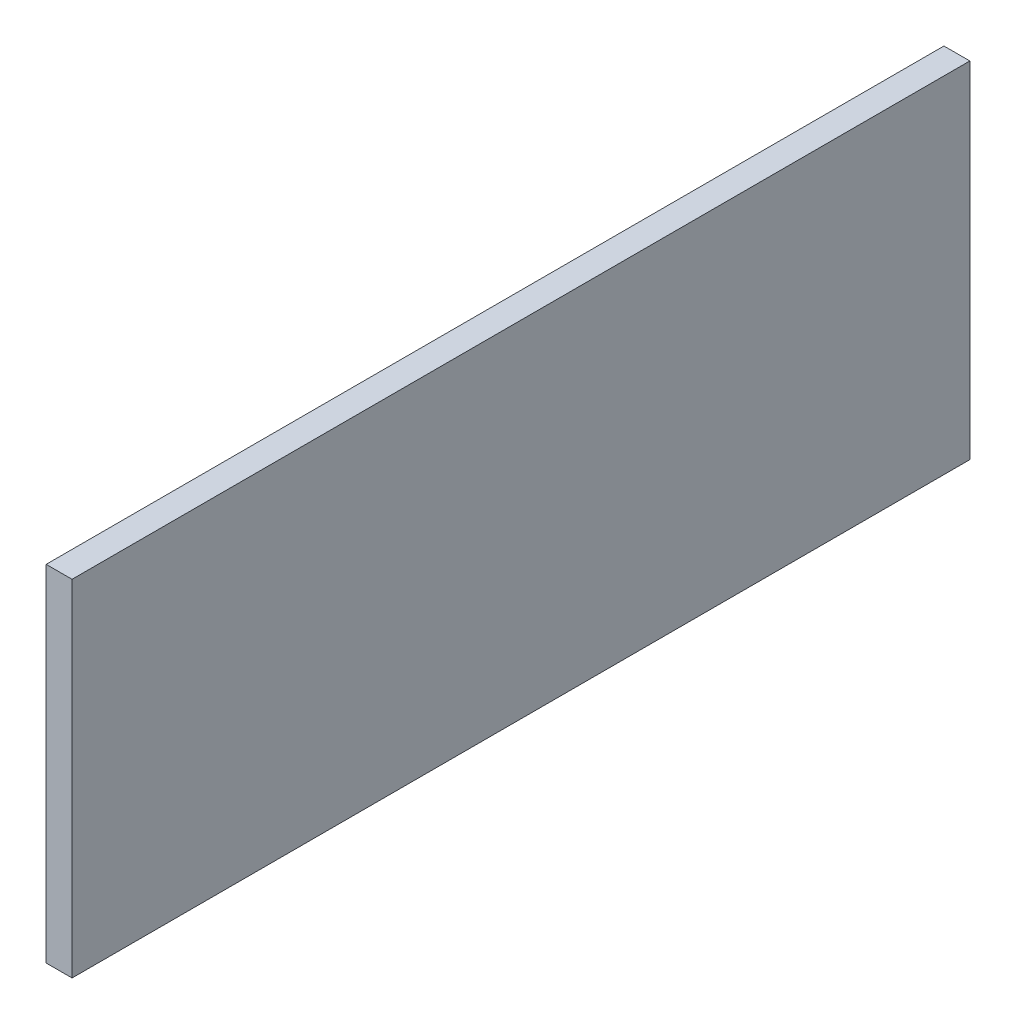
ISO-10303-21;
HEADER;
FILE_DESCRIPTION(('STEP AP214'),'2;1');
FILE_NAME('part.step','',(''),(''),'','','');
FILE_SCHEMA(('AUTOMOTIVE_DESIGN { 1 0 10303 214 1 1 1 1 }'));
ENDSEC;
DATA;
#1=APPLICATION_CONTEXT('core data for automotive mechanical design processes');
#2=APPLICATION_PROTOCOL_DEFINITION('international standard','automotive_design',2000,#1);
#3=PRODUCT_CONTEXT('',#1,'mechanical');
#4=PRODUCT('Part','Part','',(#3));
#5=PRODUCT_RELATED_PRODUCT_CATEGORY('part','',(#4));
#6=PRODUCT_DEFINITION_FORMATION('','',#4);
#7=PRODUCT_DEFINITION_CONTEXT('part definition',#1,'design');
#8=PRODUCT_DEFINITION('design','',#6,#7);
#9=PRODUCT_DEFINITION_SHAPE('','',#8);
#10=(LENGTH_UNIT() NAMED_UNIT(*) SI_UNIT(.MILLI.,.METRE.));
#11=(NAMED_UNIT(*) PLANE_ANGLE_UNIT() SI_UNIT($,.RADIAN.));
#12=(NAMED_UNIT(*) SI_UNIT($,.STERADIAN.) SOLID_ANGLE_UNIT());
#13=UNCERTAINTY_MEASURE_WITH_UNIT(LENGTH_MEASURE(1.E-05),#10,'distance_accuracy_value','');
#14=(GEOMETRIC_REPRESENTATION_CONTEXT(3) GLOBAL_UNCERTAINTY_ASSIGNED_CONTEXT((#13)) GLOBAL_UNIT_ASSIGNED_CONTEXT((#10,
#11,#12)) REPRESENTATION_CONTEXT('',''));
#15=CARTESIAN_POINT('',(0.,0.,0.));
#16=DIRECTION('',(0.,0.,1.));
#17=DIRECTION('',(1.,0.,0.));
#18=AXIS2_PLACEMENT_3D('',#15,#16,#17);
#19=CARTESIAN_POINT('',(15.,0.,260.));
#20=DIRECTION('',(0.,0.,-1.));
#21=DIRECTION('',(0.,1.,0.));
#22=AXIS2_PLACEMENT_3D('',#19,#20,#21);
#23=PLANE('',#22);
#24=DIRECTION('',(0.,-1.,0.));
#25=VECTOR('',#24,1.);
#26=CARTESIAN_POINT('',(0.,0.,260.));
#27=LINE('',#26,#25);
#28=CARTESIAN_POINT('',(0.,0.,260.));
#29=VERTEX_POINT('',#28);
#30=CARTESIAN_POINT('',(0.,-200.,260.));
#31=VERTEX_POINT('',#30);
#32=EDGE_CURVE('E96',#29,#31,#27,.T.);
#33=ORIENTED_EDGE('',*,*,#32,.T.);
#34=DIRECTION('',(-1.,0.,0.));
#35=VECTOR('',#34,1.);
#36=CARTESIAN_POINT('',(15.,-200.,260.));
#37=LINE('',#36,#35);
#38=CARTESIAN_POINT('',(15.,-200.,260.));
#39=VERTEX_POINT('',#38);
#40=EDGE_CURVE('E11',#39,#31,#37,.T.);
#41=ORIENTED_EDGE('',*,*,#40,.F.);
#42=DIRECTION('',(0.,-1.,0.));
#43=VECTOR('',#42,1.);
#44=CARTESIAN_POINT('',(15.,0.,260.));
#45=LINE('',#44,#43);
#46=CARTESIAN_POINT('',(15.,0.,260.));
#47=VERTEX_POINT('',#46);
#48=EDGE_CURVE('E84',#47,#39,#45,.T.);
#49=ORIENTED_EDGE('',*,*,#48,.F.);
#50=DIRECTION('',(-1.,0.,0.));
#51=VECTOR('',#50,1.);
#52=CARTESIAN_POINT('',(15.,0.,260.));
#53=LINE('',#52,#51);
#54=EDGE_CURVE('E92',#47,#29,#53,.T.);
#55=ORIENTED_EDGE('',*,*,#54,.T.);
#56=EDGE_LOOP('',(#33,#41,#49,#55));
#57=FACE_BOUND('',#56,.T.);
#58=ADVANCED_FACE('F33',(#57),#23,.F.);
#59=CARTESIAN_POINT('',(15.,-200.,260.));
#60=DIRECTION('',(0.,1.,0.));
#61=DIRECTION('',(0.,0.,1.));
#62=AXIS2_PLACEMENT_3D('',#59,#60,#61);
#63=PLANE('',#62);
#64=DIRECTION('',(0.,0.,-1.));
#65=VECTOR('',#64,1.);
#66=CARTESIAN_POINT('',(0.,-200.,260.));
#67=LINE('',#66,#65);
#68=CARTESIAN_POINT('',(0.,-200.,-260.));
#69=VERTEX_POINT('',#68);
#70=EDGE_CURVE('E88',#31,#69,#67,.T.);
#71=ORIENTED_EDGE('',*,*,#70,.T.);
#72=DIRECTION('',(-1.,0.,0.));
#73=VECTOR('',#72,1.);
#74=CARTESIAN_POINT('',(15.,-200.,-260.));
#75=LINE('',#74,#73);
#76=CARTESIAN_POINT('',(15.,-200.,-260.));
#77=VERTEX_POINT('',#76);
#78=EDGE_CURVE('E41',#77,#69,#75,.T.);
#79=ORIENTED_EDGE('',*,*,#78,.F.);
#80=DIRECTION('',(0.,0.,-1.));
#81=VECTOR('',#80,1.);
#82=CARTESIAN_POINT('',(15.,-200.,260.));
#83=LINE('',#82,#81);
#84=EDGE_CURVE('E79',#39,#77,#83,.T.);
#85=ORIENTED_EDGE('',*,*,#84,.F.);
#86=ORIENTED_EDGE('',*,*,#40,.T.);
#87=EDGE_LOOP('',(#71,#79,#85,#86));
#88=FACE_BOUND('',#87,.T.);
#89=ADVANCED_FACE('F87',(#88),#63,.F.);
#90=CARTESIAN_POINT('',(15.,0.,-260.));
#91=DIRECTION('',(0.,0.,1.));
#92=DIRECTION('',(0.,-1.,0.));
#93=AXIS2_PLACEMENT_3D('',#90,#91,#92);
#94=PLANE('',#93);
#95=DIRECTION('',(0.,1.,0.));
#96=VECTOR('',#95,1.);
#97=CARTESIAN_POINT('',(0.,0.,-260.));
#98=LINE('',#97,#96);
#99=CARTESIAN_POINT('',(0.,0.,-260.));
#100=VERTEX_POINT('',#99);
#101=EDGE_CURVE('E66',#69,#100,#98,.T.);
#102=ORIENTED_EDGE('',*,*,#101,.T.);
#103=DIRECTION('',(-1.,0.,0.));
#104=VECTOR('',#103,1.);
#105=CARTESIAN_POINT('',(15.,0.,-260.));
#106=LINE('',#105,#104);
#107=CARTESIAN_POINT('',(15.,0.,-260.));
#108=VERTEX_POINT('',#107);
#109=EDGE_CURVE('E89',#108,#100,#106,.T.);
#110=ORIENTED_EDGE('',*,*,#109,.F.);
#111=DIRECTION('',(0.,1.,0.));
#112=VECTOR('',#111,1.);
#113=CARTESIAN_POINT('',(15.,0.,-260.));
#114=LINE('',#113,#112);
#115=EDGE_CURVE('E82',#77,#108,#114,.T.);
#116=ORIENTED_EDGE('',*,*,#115,.F.);
#117=ORIENTED_EDGE('',*,*,#78,.T.);
#118=EDGE_LOOP('',(#102,#110,#116,#117));
#119=FACE_BOUND('',#118,.T.);
#120=ADVANCED_FACE('F90',(#119),#94,.F.);
#121=CARTESIAN_POINT('',(15.,0.,260.));
#122=DIRECTION('',(0.,-1.,0.));
#123=DIRECTION('',(0.,0.,-1.));
#124=AXIS2_PLACEMENT_3D('',#121,#122,#123);
#125=PLANE('',#124);
#126=DIRECTION('',(0.,0.,1.));
#127=VECTOR('',#126,1.);
#128=CARTESIAN_POINT('',(0.,0.,260.));
#129=LINE('',#128,#127);
#130=EDGE_CURVE('E72',#100,#29,#129,.T.);
#131=ORIENTED_EDGE('',*,*,#130,.T.);
#132=ORIENTED_EDGE('',*,*,#54,.F.);
#133=DIRECTION('',(0.,0.,1.));
#134=VECTOR('',#133,1.);
#135=CARTESIAN_POINT('',(15.,0.,260.));
#136=LINE('',#135,#134);
#137=EDGE_CURVE('E49',#108,#47,#136,.T.);
#138=ORIENTED_EDGE('',*,*,#137,.F.);
#139=ORIENTED_EDGE('',*,*,#109,.T.);
#140=EDGE_LOOP('',(#131,#132,#138,#139));
#141=FACE_BOUND('',#140,.T.);
#142=ADVANCED_FACE('F103',(#141),#125,.F.);
#143=CARTESIAN_POINT('',(15.,0.,0.));
#144=DIRECTION('',(1.,0.,0.));
#145=DIRECTION('',(0.,0.,-1.));
#146=AXIS2_PLACEMENT_3D('',#143,#144,#145);
#147=PLANE('',#146);
#148=ORIENTED_EDGE('',*,*,#48,.T.);
#149=ORIENTED_EDGE('',*,*,#84,.T.);
#150=ORIENTED_EDGE('',*,*,#115,.T.);
#151=ORIENTED_EDGE('',*,*,#137,.T.);
#152=EDGE_LOOP('',(#148,#149,#150,#151));
#153=FACE_BOUND('',#152,.T.);
#154=ADVANCED_FACE('F80',(#153),#147,.T.);
#155=CARTESIAN_POINT('',(0.,0.,0.));
#156=DIRECTION('',(1.,0.,0.));
#157=DIRECTION('',(0.,0.,-1.));
#158=AXIS2_PLACEMENT_3D('',#155,#156,#157);
#159=PLANE('',#158);
#160=ORIENTED_EDGE('',*,*,#32,.F.);
#161=ORIENTED_EDGE('',*,*,#130,.F.);
#162=ORIENTED_EDGE('',*,*,#101,.F.);
#163=ORIENTED_EDGE('',*,*,#70,.F.);
#164=EDGE_LOOP('',(#160,#161,#162,#163));
#165=FACE_BOUND('',#164,.T.);
#166=ADVANCED_FACE('F106',(#165),#159,.F.);
#167=CLOSED_SHELL('',(#58,#89,#120,#142,#154,#166));
#168=MANIFOLD_SOLID_BREP('B2',#167);
#169=ADVANCED_BREP_SHAPE_REPRESENTATION('',(#18,#168),#14);
#170=SHAPE_DEFINITION_REPRESENTATION(#9,#169);
ENDSEC;
END-ISO-10303-21;
